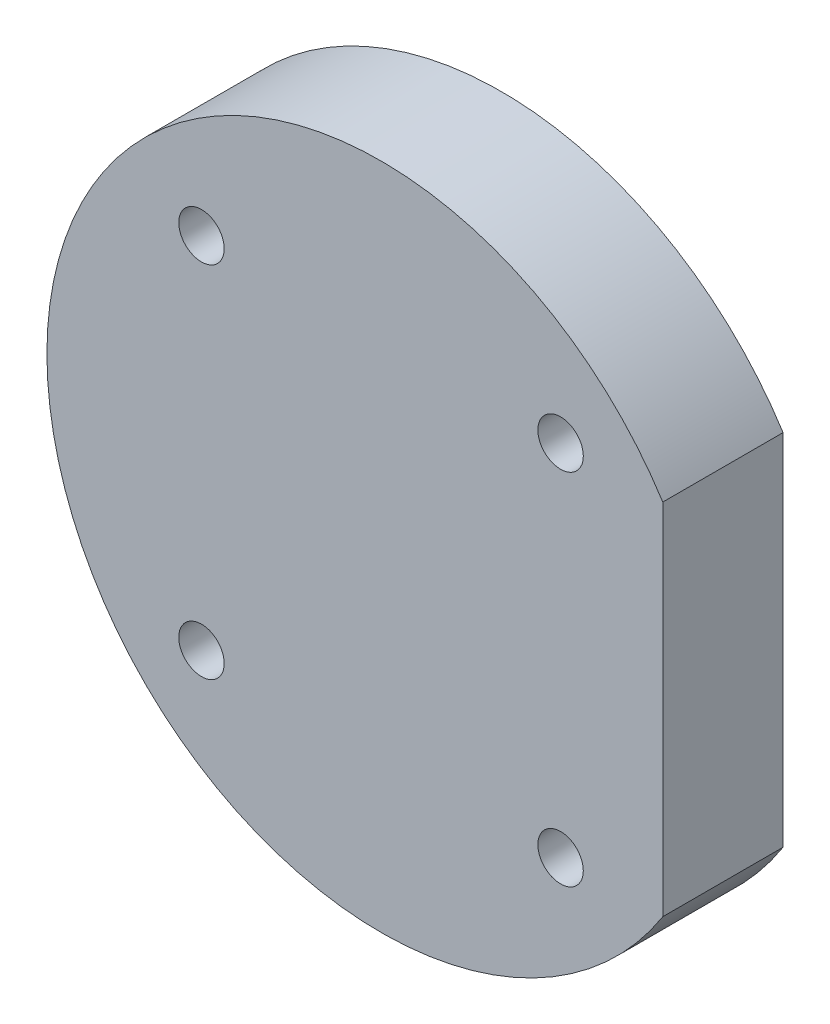
ISO-10303-21;
HEADER;
FILE_DESCRIPTION(('STEP AP214'),'2;1');
FILE_NAME('part.step','',(''),(''),'','','');
FILE_SCHEMA(('AUTOMOTIVE_DESIGN { 1 0 10303 214 1 1 1 1 }'));
ENDSEC;
DATA;
#1=APPLICATION_CONTEXT('core data for automotive mechanical design processes');
#2=APPLICATION_PROTOCOL_DEFINITION('international standard','automotive_design',2000,#1);
#3=PRODUCT_CONTEXT('',#1,'mechanical');
#4=PRODUCT('Part','Part','',(#3));
#5=PRODUCT_RELATED_PRODUCT_CATEGORY('part','',(#4));
#6=PRODUCT_DEFINITION_FORMATION('','',#4);
#7=PRODUCT_DEFINITION_CONTEXT('part definition',#1,'design');
#8=PRODUCT_DEFINITION('design','',#6,#7);
#9=PRODUCT_DEFINITION_SHAPE('','',#8);
#10=(LENGTH_UNIT() NAMED_UNIT(*) SI_UNIT(.MILLI.,.METRE.));
#11=(NAMED_UNIT(*) PLANE_ANGLE_UNIT() SI_UNIT($,.RADIAN.));
#12=(NAMED_UNIT(*) SI_UNIT($,.STERADIAN.) SOLID_ANGLE_UNIT());
#13=UNCERTAINTY_MEASURE_WITH_UNIT(LENGTH_MEASURE(1.E-05),#10,'distance_accuracy_value','');
#14=(GEOMETRIC_REPRESENTATION_CONTEXT(3) GLOBAL_UNCERTAINTY_ASSIGNED_CONTEXT((#13)) GLOBAL_UNIT_ASSIGNED_CONTEXT((#10,
#11,#12)) REPRESENTATION_CONTEXT('',''));
#15=CARTESIAN_POINT('',(0.,0.,0.));
#16=DIRECTION('',(0.,0.,1.));
#17=DIRECTION('',(1.,0.,0.));
#18=AXIS2_PLACEMENT_3D('',#15,#16,#17);
#19=CARTESIAN_POINT('',(0.,0.,9.));
#20=DIRECTION('',(0.,0.,1.));
#21=DIRECTION('',(1.,0.,0.));
#22=AXIS2_PLACEMENT_3D('',#19,#20,#21);
#23=PLANE('',#22);
#24=DIRECTION('',(0.,1.,0.));
#25=VECTOR('',#24,1.);
#26=CARTESIAN_POINT('',(21.083168642308,13.4350288425444,9.));
#27=LINE('',#26,#25);
#28=CARTESIAN_POINT('',(21.083168642308,-13.4350288425444,9.));
#29=VERTEX_POINT('',#28);
#30=CARTESIAN_POINT('',(21.083168642308,13.4350288425444,9.));
#31=VERTEX_POINT('',#30);
#32=EDGE_CURVE('E205',#29,#31,#27,.T.);
#33=ORIENTED_EDGE('',*,*,#32,.T.);
#34=CARTESIAN_POINT('',(0.,0.,9.));
#35=DIRECTION('',(0.,0.,1.));
#36=DIRECTION('',(1.,0.,0.));
#37=AXIS2_PLACEMENT_3D('',#34,#35,#36);
#38=CIRCLE('',#37,25.);
#39=EDGE_CURVE('E124',#31,#29,#38,.T.);
#40=ORIENTED_EDGE('',*,*,#39,.T.);
#41=EDGE_LOOP('',(#33,#40));
#42=FACE_BOUND('',#41,.T.);
#43=CARTESIAN_POINT('',(13.4350288425444,-13.4350288425444,9.));
#44=DIRECTION('',(0.,0.,1.));
#45=DIRECTION('',(1.,0.,0.));
#46=AXIS2_PLACEMENT_3D('',#43,#44,#45);
#47=CIRCLE('',#46,1.7);
#48=CARTESIAN_POINT('',(15.1350288425444,-13.4350288425444,9.));
#49=VERTEX_POINT('',#48);
#50=EDGE_CURVE('E227',#49,#49,#47,.T.);
#51=ORIENTED_EDGE('',*,*,#50,.F.);
#52=EDGE_LOOP('',(#51));
#53=FACE_BOUND('',#52,.T.);
#54=CARTESIAN_POINT('',(13.4350288425444,13.4350288425444,9.));
#55=DIRECTION('',(0.,0.,1.));
#56=DIRECTION('',(1.,0.,0.));
#57=AXIS2_PLACEMENT_3D('',#54,#55,#56);
#58=CIRCLE('',#57,1.7);
#59=CARTESIAN_POINT('',(15.1350288425444,13.4350288425444,9.));
#60=VERTEX_POINT('',#59);
#61=EDGE_CURVE('E243',#60,#60,#58,.T.);
#62=ORIENTED_EDGE('',*,*,#61,.F.);
#63=EDGE_LOOP('',(#62));
#64=FACE_BOUND('',#63,.T.);
#65=CARTESIAN_POINT('',(-13.4350288425444,13.4350288425444,9.));
#66=DIRECTION('',(0.,0.,1.));
#67=DIRECTION('',(1.,0.,0.));
#68=AXIS2_PLACEMENT_3D('',#65,#66,#67);
#69=CIRCLE('',#68,1.7);
#70=CARTESIAN_POINT('',(-11.7350288425444,13.4350288425444,9.));
#71=VERTEX_POINT('',#70);
#72=EDGE_CURVE('E235',#71,#71,#69,.T.);
#73=ORIENTED_EDGE('',*,*,#72,.F.);
#74=EDGE_LOOP('',(#73));
#75=FACE_BOUND('',#74,.T.);
#76=CARTESIAN_POINT('',(-13.4350288425444,-13.4350288425444,9.));
#77=DIRECTION('',(0.,0.,1.));
#78=DIRECTION('',(1.,0.,0.));
#79=AXIS2_PLACEMENT_3D('',#76,#77,#78);
#80=CIRCLE('',#79,1.7);
#81=CARTESIAN_POINT('',(-11.7350288425444,-13.4350288425444,9.));
#82=VERTEX_POINT('',#81);
#83=EDGE_CURVE('E219',#82,#82,#80,.T.);
#84=ORIENTED_EDGE('',*,*,#83,.F.);
#85=EDGE_LOOP('',(#84));
#86=FACE_BOUND('',#85,.T.);
#87=ADVANCED_FACE('F40',(#42,#53,#64,#75,#86),#23,.T.);
#88=CARTESIAN_POINT('',(0.,0.,0.));
#89=DIRECTION('',(0.,0.,1.));
#90=DIRECTION('',(1.,0.,0.));
#91=AXIS2_PLACEMENT_3D('',#88,#89,#90);
#92=PLANE('',#91);
#93=CARTESIAN_POINT('',(0.,0.,0.));
#94=DIRECTION('',(0.,0.,1.));
#95=DIRECTION('',(1.,0.,0.));
#96=AXIS2_PLACEMENT_3D('',#93,#94,#95);
#97=CIRCLE('',#96,25.);
#98=CARTESIAN_POINT('',(-24.8193472919817,-2.99999999999999,0.));
#99=VERTEX_POINT('',#98);
#100=CARTESIAN_POINT('',(21.083168642308,-13.4350288425444,0.));
#101=VERTEX_POINT('',#100);
#102=EDGE_CURVE('E247',#99,#101,#97,.T.);
#103=ORIENTED_EDGE('',*,*,#102,.F.);
#104=DIRECTION('',(-1.,0.,0.));
#105=VECTOR('',#104,1.);
#106=CARTESIAN_POINT('',(-28.1130547912198,-2.99999999999999,0.));
#107=LINE('',#106,#105);
#108=CARTESIAN_POINT('',(-10.5830052442584,-3.,0.));
#109=VERTEX_POINT('',#108);
#110=EDGE_CURVE('E195',#109,#99,#107,.T.);
#111=ORIENTED_EDGE('',*,*,#110,.F.);
#112=CARTESIAN_POINT('',(0.,0.,0.));
#113=DIRECTION('',(0.,0.,-1.));
#114=DIRECTION('',(-1.,0.,0.));
#115=AXIS2_PLACEMENT_3D('',#112,#113,#114);
#116=CIRCLE('',#115,11.);
#117=CARTESIAN_POINT('',(-10.5830052442584,3.00000000000001,0.));
#118=VERTEX_POINT('',#117);
#119=EDGE_CURVE('E214',#118,#109,#116,.T.);
#120=ORIENTED_EDGE('',*,*,#119,.F.);
#121=DIRECTION('',(1.,0.,0.));
#122=VECTOR('',#121,1.);
#123=CARTESIAN_POINT('',(-28.1130547912198,3.00000000000001,0.));
#124=LINE('',#123,#122);
#125=CARTESIAN_POINT('',(-24.8193472919817,3.00000000000001,0.));
#126=VERTEX_POINT('',#125);
#127=EDGE_CURVE('E268',#126,#118,#124,.T.);
#128=ORIENTED_EDGE('',*,*,#127,.F.);
#129=CARTESIAN_POINT('',(21.083168642308,13.4350288425444,0.));
#130=VERTEX_POINT('',#129);
#131=EDGE_CURVE('E131',#130,#126,#97,.T.);
#132=ORIENTED_EDGE('',*,*,#131,.F.);
#133=DIRECTION('',(0.,1.,0.));
#134=VECTOR('',#133,1.);
#135=CARTESIAN_POINT('',(21.083168642308,13.4350288425444,0.));
#136=LINE('',#135,#134);
#137=EDGE_CURVE('E69',#101,#130,#136,.T.);
#138=ORIENTED_EDGE('',*,*,#137,.F.);
#139=EDGE_LOOP('',(#103,#111,#120,#128,#132,#138));
#140=FACE_BOUND('',#139,.T.);
#141=CARTESIAN_POINT('',(13.4350288425444,13.4350288425444,0.));
#142=DIRECTION('',(0.,0.,1.));
#143=DIRECTION('',(1.,0.,0.));
#144=AXIS2_PLACEMENT_3D('',#141,#142,#143);
#145=CIRCLE('',#144,1.7);
#146=CARTESIAN_POINT('',(15.1350288425444,13.4350288425444,0.));
#147=VERTEX_POINT('',#146);
#148=EDGE_CURVE('E239',#147,#147,#145,.T.);
#149=ORIENTED_EDGE('',*,*,#148,.T.);
#150=EDGE_LOOP('',(#149));
#151=FACE_BOUND('',#150,.T.);
#152=CARTESIAN_POINT('',(-13.4350288425444,13.4350288425444,0.));
#153=DIRECTION('',(0.,0.,1.));
#154=DIRECTION('',(1.,0.,0.));
#155=AXIS2_PLACEMENT_3D('',#152,#153,#154);
#156=CIRCLE('',#155,1.7);
#157=CARTESIAN_POINT('',(-11.7350288425444,13.4350288425444,0.));
#158=VERTEX_POINT('',#157);
#159=EDGE_CURVE('E231',#158,#158,#156,.T.);
#160=ORIENTED_EDGE('',*,*,#159,.T.);
#161=EDGE_LOOP('',(#160));
#162=FACE_BOUND('',#161,.T.);
#163=CARTESIAN_POINT('',(13.4350288425444,-13.4350288425444,0.));
#164=DIRECTION('',(0.,0.,1.));
#165=DIRECTION('',(1.,0.,0.));
#166=AXIS2_PLACEMENT_3D('',#163,#164,#165);
#167=CIRCLE('',#166,1.7);
#168=CARTESIAN_POINT('',(15.1350288425444,-13.4350288425444,0.));
#169=VERTEX_POINT('',#168);
#170=EDGE_CURVE('E223',#169,#169,#167,.T.);
#171=ORIENTED_EDGE('',*,*,#170,.T.);
#172=EDGE_LOOP('',(#171));
#173=FACE_BOUND('',#172,.T.);
#174=CARTESIAN_POINT('',(-13.4350288425444,-13.4350288425444,0.));
#175=DIRECTION('',(0.,0.,1.));
#176=DIRECTION('',(1.,0.,0.));
#177=AXIS2_PLACEMENT_3D('',#174,#175,#176);
#178=CIRCLE('',#177,1.7);
#179=CARTESIAN_POINT('',(-11.7350288425444,-13.4350288425444,0.));
#180=VERTEX_POINT('',#179);
#181=EDGE_CURVE('E218',#180,#180,#178,.T.);
#182=ORIENTED_EDGE('',*,*,#181,.T.);
#183=EDGE_LOOP('',(#182));
#184=FACE_BOUND('',#183,.T.);
#185=ADVANCED_FACE('F176',(#140,#151,#162,#173,#184),#92,.F.);
#186=CARTESIAN_POINT('',(0.,0.,9.));
#187=DIRECTION('',(0.,0.,-1.));
#188=DIRECTION('',(-1.,0.,0.));
#189=AXIS2_PLACEMENT_3D('',#186,#187,#188);
#190=CYLINDRICAL_SURFACE('',#189,25.);
#191=CARTESIAN_POINT('',(0.,0.,6.));
#192=DIRECTION('',(0.,0.,-1.));
#193=DIRECTION('',(-1.,0.,0.));
#194=AXIS2_PLACEMENT_3D('',#191,#192,#193);
#195=CIRCLE('',#194,25.);
#196=CARTESIAN_POINT('',(-24.8193472919817,-2.99999999999999,6.));
#197=VERTEX_POINT('',#196);
#198=CARTESIAN_POINT('',(-24.8193472919817,3.00000000000001,6.));
#199=VERTEX_POINT('',#198);
#200=EDGE_CURVE('E113',#197,#199,#195,.T.);
#201=ORIENTED_EDGE('',*,*,#200,.F.);
#202=DIRECTION('',(0.,0.,-1.));
#203=VECTOR('',#202,1.);
#204=CARTESIAN_POINT('',(-24.8193472919817,-2.99999999999999,9.));
#205=LINE('',#204,#203);
#206=EDGE_CURVE('E110',#197,#99,#205,.T.);
#207=ORIENTED_EDGE('',*,*,#206,.T.);
#208=ORIENTED_EDGE('',*,*,#102,.T.);
#209=DIRECTION('',(0.,0.,-1.));
#210=VECTOR('',#209,1.);
#211=CARTESIAN_POINT('',(21.083168642308,-13.4350288425444,9.));
#212=LINE('',#211,#210);
#213=EDGE_CURVE('E128',#101,#29,#212,.F.);
#214=ORIENTED_EDGE('',*,*,#213,.T.);
#215=ORIENTED_EDGE('',*,*,#39,.F.);
#216=DIRECTION('',(0.,0.,-1.));
#217=VECTOR('',#216,1.);
#218=CARTESIAN_POINT('',(21.083168642308,13.4350288425444,9.));
#219=LINE('',#218,#217);
#220=EDGE_CURVE('E209',#31,#130,#219,.T.);
#221=ORIENTED_EDGE('',*,*,#220,.T.);
#222=ORIENTED_EDGE('',*,*,#131,.T.);
#223=DIRECTION('',(0.,0.,-1.));
#224=VECTOR('',#223,1.);
#225=CARTESIAN_POINT('',(-24.8193472919817,3.00000000000001,9.));
#226=LINE('',#225,#224);
#227=EDGE_CURVE('E187',#126,#199,#226,.F.);
#228=ORIENTED_EDGE('',*,*,#227,.T.);
#229=EDGE_LOOP('',(#201,#207,#208,#214,#215,#221,#222,#228));
#230=FACE_BOUND('',#229,.T.);
#231=ADVANCED_FACE('F172',(#230),#190,.T.);
#232=CARTESIAN_POINT('',(13.4350288425444,13.4350288425444,9.));
#233=DIRECTION('',(0.,0.,-1.));
#234=DIRECTION('',(-1.,0.,0.));
#235=AXIS2_PLACEMENT_3D('',#232,#233,#234);
#236=CYLINDRICAL_SURFACE('',#235,1.7);
#237=ORIENTED_EDGE('',*,*,#61,.T.);
#238=EDGE_LOOP('',(#237));
#239=FACE_BOUND('',#238,.T.);
#240=ORIENTED_EDGE('',*,*,#148,.F.);
#241=EDGE_LOOP('',(#240));
#242=FACE_BOUND('',#241,.T.);
#243=ADVANCED_FACE('F168',(#239,#242),#236,.F.);
#244=CARTESIAN_POINT('',(-13.4350288425444,13.4350288425444,9.));
#245=DIRECTION('',(0.,0.,-1.));
#246=DIRECTION('',(-1.,0.,0.));
#247=AXIS2_PLACEMENT_3D('',#244,#245,#246);
#248=CYLINDRICAL_SURFACE('',#247,1.7);
#249=ORIENTED_EDGE('',*,*,#72,.T.);
#250=EDGE_LOOP('',(#249));
#251=FACE_BOUND('',#250,.T.);
#252=ORIENTED_EDGE('',*,*,#159,.F.);
#253=EDGE_LOOP('',(#252));
#254=FACE_BOUND('',#253,.T.);
#255=ADVANCED_FACE('F164',(#251,#254),#248,.F.);
#256=CARTESIAN_POINT('',(13.4350288425444,-13.4350288425444,9.));
#257=DIRECTION('',(0.,0.,-1.));
#258=DIRECTION('',(-1.,0.,0.));
#259=AXIS2_PLACEMENT_3D('',#256,#257,#258);
#260=CYLINDRICAL_SURFACE('',#259,1.7);
#261=ORIENTED_EDGE('',*,*,#50,.T.);
#262=EDGE_LOOP('',(#261));
#263=FACE_BOUND('',#262,.T.);
#264=ORIENTED_EDGE('',*,*,#170,.F.);
#265=EDGE_LOOP('',(#264));
#266=FACE_BOUND('',#265,.T.);
#267=ADVANCED_FACE('F160',(#263,#266),#260,.F.);
#268=CARTESIAN_POINT('',(-13.4350288425444,-13.4350288425444,9.));
#269=DIRECTION('',(0.,0.,-1.));
#270=DIRECTION('',(-1.,0.,0.));
#271=AXIS2_PLACEMENT_3D('',#268,#269,#270);
#272=CYLINDRICAL_SURFACE('',#271,1.7);
#273=ORIENTED_EDGE('',*,*,#83,.T.);
#274=EDGE_LOOP('',(#273));
#275=FACE_BOUND('',#274,.T.);
#276=ORIENTED_EDGE('',*,*,#181,.F.);
#277=EDGE_LOOP('',(#276));
#278=FACE_BOUND('',#277,.T.);
#279=ADVANCED_FACE('F156',(#275,#278),#272,.F.);
#280=CARTESIAN_POINT('',(0.,0.,6.));
#281=DIRECTION('',(0.,0.,-1.));
#282=DIRECTION('',(-1.,0.,0.));
#283=AXIS2_PLACEMENT_3D('',#280,#281,#282);
#284=CYLINDRICAL_SURFACE('',#283,11.);
#285=ORIENTED_EDGE('',*,*,#119,.T.);
#286=DIRECTION('',(0.,0.,-1.));
#287=VECTOR('',#286,1.);
#288=CARTESIAN_POINT('',(-10.5830052442584,-3.,6.));
#289=LINE('',#288,#287);
#290=CARTESIAN_POINT('',(-10.5830052442584,-3.,5.5));
#291=VERTEX_POINT('',#290);
#292=EDGE_CURVE('E200',#109,#291,#289,.F.);
#293=ORIENTED_EDGE('',*,*,#292,.T.);
#294=CARTESIAN_POINT('',(0.,0.,5.5));
#295=DIRECTION('',(0.,0.,-1.));
#296=DIRECTION('',(-1.,0.,0.));
#297=AXIS2_PLACEMENT_3D('',#294,#295,#296);
#298=CIRCLE('',#297,11.);
#299=CARTESIAN_POINT('',(-10.5830052442598,3.00000000000001,5.49999999999981));
#300=VERTEX_POINT('',#299);
#301=EDGE_CURVE('E121',#291,#300,#298,.F.);
#302=ORIENTED_EDGE('',*,*,#301,.T.);
#303=DIRECTION('',(0.,0.,-1.));
#304=VECTOR('',#303,1.);
#305=CARTESIAN_POINT('',(-10.5830052442584,3.00000000000001,6.));
#306=LINE('',#305,#304);
#307=EDGE_CURVE('E189',#300,#118,#306,.T.);
#308=ORIENTED_EDGE('',*,*,#307,.T.);
#309=EDGE_LOOP('',(#285,#293,#302,#308));
#310=FACE_BOUND('',#309,.T.);
#311=ADVANCED_FACE('F153',(#310),#284,.F.);
#312=CARTESIAN_POINT('',(0.,0.,6.));
#313=DIRECTION('',(0.,0.,-1.));
#314=DIRECTION('',(-1.,0.,0.));
#315=AXIS2_PLACEMENT_3D('',#312,#313,#314);
#316=PLANE('',#315);
#317=CARTESIAN_POINT('',(0.,0.,6.));
#318=DIRECTION('',(0.,0.,-1.));
#319=DIRECTION('',(-1.,0.,0.));
#320=AXIS2_PLACEMENT_3D('',#317,#318,#319);
#321=CIRCLE('',#320,10.5);
#322=CARTESIAN_POINT('',(-10.0623058987491,3.00000000000001,6.));
#323=VERTEX_POINT('',#322);
#324=CARTESIAN_POINT('',(-10.0623058987491,-3.,6.));
#325=VERTEX_POINT('',#324);
#326=EDGE_CURVE('E119',#323,#325,#321,.T.);
#327=ORIENTED_EDGE('',*,*,#326,.T.);
#328=DIRECTION('',(-1.,0.,0.));
#329=VECTOR('',#328,1.);
#330=CARTESIAN_POINT('',(-28.1130547912198,-2.99999999999999,6.));
#331=LINE('',#330,#329);
#332=EDGE_CURVE('E106',#325,#197,#331,.T.);
#333=ORIENTED_EDGE('',*,*,#332,.T.);
#334=ORIENTED_EDGE('',*,*,#200,.T.);
#335=DIRECTION('',(1.,0.,0.));
#336=VECTOR('',#335,1.);
#337=CARTESIAN_POINT('',(-28.1130547912198,3.00000000000001,6.));
#338=LINE('',#337,#336);
#339=EDGE_CURVE('E61',#199,#323,#338,.T.);
#340=ORIENTED_EDGE('',*,*,#339,.T.);
#341=EDGE_LOOP('',(#327,#333,#334,#340));
#342=FACE_BOUND('',#341,.T.);
#343=ADVANCED_FACE('F122',(#342),#316,.T.);
#344=CARTESIAN_POINT('',(0.,0.,5.5));
#345=DIRECTION('',(0.,0.,-1.));
#346=DIRECTION('',(-1.,0.,0.));
#347=AXIS2_PLACEMENT_3D('',#344,#345,#346);
#348=TOROIDAL_SURFACE('',#347,10.5,0.5);
#349=ORIENTED_EDGE('',*,*,#301,.F.);
#350=CARTESIAN_POINT('',(-10.5693874990842,-3.,5.61370687911136));
#351=CARTESIAN_POINT('',(-10.5628393005221,-3.,5.64067479665005));
#352=CARTESIAN_POINT('',(-10.553959162086,-3.,5.6671005053182));
#353=CARTESIAN_POINT('',(-10.5318383229587,-3.,5.71808618242449));
#354=CARTESIAN_POINT('',(-10.5185913017283,-3.,5.74264338263267));
#355=CARTESIAN_POINT('',(-10.4882101493525,-3.,5.78915737298589));
#356=CARTESIAN_POINT('',(-10.471083061635,-3.,5.81111876667199));
#357=CARTESIAN_POINT('',(-10.4334731704295,-3.,5.85193248219489));
#358=CARTESIAN_POINT('',(-10.4129910927619,-3.,5.87078547473879));
#359=CARTESIAN_POINT('',(-10.3687311547526,-3.,5.90537684082903));
#360=CARTESIAN_POINT('',(-10.3448847713881,-3.,5.9210274650614));
#361=CARTESIAN_POINT('',(-10.2949793739735,-3.,5.94827635948349));
#362=CARTESIAN_POINT('',(-10.2689198698893,-3.,5.95987372926923));
#363=CARTESIAN_POINT('',(-10.2142569462085,-3.,5.97914630148087));
#364=CARTESIAN_POINT('',(-10.1855942221677,-3.,5.98665339623866));
#365=CARTESIAN_POINT('',(-10.127428093006,-3.,5.9968986399594));
#366=CARTESIAN_POINT('',(-10.0979245406893,-3.,5.99963594864489));
#367=CARTESIAN_POINT('',(-10.0380129834037,-3.,6.00030547139362));
#368=CARTESIAN_POINT('',(-10.0076033278125,-3.,5.99809749067168));
#369=CARTESIAN_POINT('',(-9.94757506734846,-3.,5.98864161555518));
#370=CARTESIAN_POINT('',(-9.91795652898295,-3.,5.98139329880729));
#371=CARTESIAN_POINT('',(-9.86018863583264,-3.,5.96196102209171));
#372=CARTESIAN_POINT('',(-9.83204883013477,-3.,5.94974859506966));
#373=CARTESIAN_POINT('',(-9.77828283301962,-3.,5.92066801420495));
#374=CARTESIAN_POINT('',(-9.75265643678838,-3.,5.90380024014745));
#375=CARTESIAN_POINT('',(-9.70529955702746,-3.,5.86625691106217));
#376=CARTESIAN_POINT('',(-9.68349406687048,-3.,5.84567610731618));
#377=CARTESIAN_POINT('',(-9.64383726499204,-3.,5.8010012964437));
#378=CARTESIAN_POINT('',(-9.62598493108573,-3.,5.77690820018434));
#379=CARTESIAN_POINT('',(-9.59556843379097,-3.,5.72699476046517));
#380=CARTESIAN_POINT('',(-9.58281072729057,-3.,5.70129238924654));
#381=CARTESIAN_POINT('',(-9.56200866735423,-3.,5.64804637078094));
#382=CARTESIAN_POINT('',(-9.55396298314189,-3.,5.62050324585306));
#383=CARTESIAN_POINT('',(-9.54313332493455,-3.,5.56560243960003));
#384=CARTESIAN_POINT('',(-9.54014305600389,-3.,5.5382853220591));
#385=CARTESIAN_POINT('',(-9.53889078221212,-3.,5.48354471304814));
#386=CARTESIAN_POINT('',(-9.5406280935001,-3.,5.45612123753596));
#387=CARTESIAN_POINT('',(-9.54868508670411,-3.,5.40249907391778));
#388=CARTESIAN_POINT('',(-9.55491609340573,-3.,5.37628697732007));
#389=CARTESIAN_POINT('',(-9.57163832626016,-3.,5.32526160733263));
#390=CARTESIAN_POINT('',(-9.58212967323672,-3.,5.30044837363756));
#391=CARTESIAN_POINT('',(-9.60717161147398,-3.,5.25257544417142));
#392=CARTESIAN_POINT('',(-9.62177065876072,-3.,5.22954114218266));
#393=CARTESIAN_POINT('',(-9.65449991769417,-3.,5.18613825095506));
#394=CARTESIAN_POINT('',(-9.67263067861349,-3.,5.16577007719288));
#395=CARTESIAN_POINT('',(-9.71260570401399,-3.,5.12747069385008));
#396=CARTESIAN_POINT('',(-9.73456176372057,-3.,5.10965623871835));
#397=CARTESIAN_POINT('',(-9.78104696881778,-3.,5.07778208621086));
#398=CARTESIAN_POINT('',(-9.80557666040152,-3.,5.06372318811821));
#399=CARTESIAN_POINT('',(-9.85766324366386,-3.,5.03912154798002));
#400=CARTESIAN_POINT('',(-9.8853056664983,-3.,5.02875977679424));
#401=CARTESIAN_POINT('',(-9.941906655498,-3.,5.01266160056117));
#402=CARTESIAN_POINT('',(-9.9708654673127,-3.,5.00692606258253));
#403=CARTESIAN_POINT('',(-10.0302629456984,-3.,5.00009637222065));
#404=CARTESIAN_POINT('',(-10.0607193747651,-3.,4.99915578939087));
#405=CARTESIAN_POINT('',(-10.1213658805215,-3.,5.00236249064431));
#406=CARTESIAN_POINT('',(-10.1515559341406,-3.,5.00651021114565));
#407=CARTESIAN_POINT('',(-10.2110092111955,-3.,5.0198621583929));
#408=CARTESIAN_POINT('',(-10.2402650439428,-3.,5.02909942078544));
#409=CARTESIAN_POINT('',(-10.2967622961234,-3.,5.05245545202905));
#410=CARTESIAN_POINT('',(-10.3240038717341,-3.,5.06657384193415));
#411=CARTESIAN_POINT('',(-10.375074503919,-3.,5.09901637002118));
#412=CARTESIAN_POINT('',(-10.3989622132228,-3.,5.11724805594579));
#413=CARTESIAN_POINT('',(-10.443185699363,-3.,5.157605289078));
#414=CARTESIAN_POINT('',(-10.4635223778483,-3.,5.17972984496681));
#415=CARTESIAN_POINT('',(-10.4992425340995,-3.,5.22635663210449));
#416=CARTESIAN_POINT('',(-10.5147834677409,-3.,5.2507382232365));
#417=CARTESIAN_POINT('',(-10.5413700521138,-3.,5.30184996749589));
#418=CARTESIAN_POINT('',(-10.5524155494274,-3.,5.32858020073867));
#419=CARTESIAN_POINT('',(-10.5692831423429,-3.,5.38255788761337));
#420=CARTESIAN_POINT('',(-10.5752823523868,-3.,5.40975019199442));
#421=CARTESIAN_POINT('',(-10.5825082786879,-3.,5.46473588006266));
#422=CARTESIAN_POINT('',(-10.5837420246128,-3.,5.49252831752601));
#423=CARTESIAN_POINT('',(-10.5819200175944,-3.,5.53595199500101));
#424=CARTESIAN_POINT('',(-10.5804822555139,-3.,5.55166780722536));
#425=CARTESIAN_POINT('',(-10.5760764660983,-3.,5.58288306253033));
#426=CARTESIAN_POINT('',(-10.5731084762681,-3.,5.59838251090435));
#427=CARTESIAN_POINT('',(-10.5693874990842,-3.,5.61370687911136));
#428=B_SPLINE_CURVE_WITH_KNOTS('',3,(#350,#351,#352,#353,#354,#355,#356,#357,#358,#359,#360,
#361,#362,#363,#364,#365,#366,#367,#368,#369,#370,#371,#372,#373,#374,#375,#376,#377,#378,#379,
#380,#381,#382,#383,#384,#385,#386,#387,#388,#389,#390,#391,#392,#393,#394,#395,#396,#397,#398,
#399,#400,#401,#402,#403,#404,#405,#406,#407,#408,#409,#410,#411,#412,#413,#414,#415,#416,#417,
#418,#419,#420,#421,#422,#423,#424,#425,#426,#427),.UNSPECIFIED.,.T.,.F.,(4,2,2,2,2,2,2,2,2,2,2,
2,2,2,2,2,2,2,2,2,2,2,2,2,2,2,2,2,2,2,2,2,2,2,2,2,2,2,4),(0.,0.0831948426814113,
0.166510632533976,0.249676375415534,0.332824149875666,0.418011610674086,0.503217983299868,
0.591703279814202,0.680204162915563,0.771245625531753,0.862294717857547,0.953873474331868,
1.04544476197992,1.13494493475024,1.22442193797658,1.31007141858055,1.39569669825022,
1.47773513053404,1.55976169647785,1.6402124127333,1.72066541073991,1.80211040547319,
1.88356807713305,1.96801284544561,2.05247557157323,2.14063762407171,2.22881619644658,
2.31980190308456,2.41079541401081,2.50238663290543,2.59397074271863,2.68367161463677,
2.77334967721209,2.85965671648478,2.94596670095255,3.02910338354484,3.11211738198172,
3.15939354436679,3.20666854809465),.UNSPECIFIED.);
#429=EDGE_CURVE('E11',#291,#325,#428,.T.);
#430=ORIENTED_EDGE('',*,*,#429,.T.);
#431=ORIENTED_EDGE('',*,*,#326,.F.);
#432=CARTESIAN_POINT('',(-10.5693874990842,3.00000000000001,5.61370687911136));
#433=CARTESIAN_POINT('',(-10.5757784943751,3.00000000000001,5.58737495505135));
#434=CARTESIAN_POINT('',(-10.5799563121818,3.00000000000001,5.56048694431995));
#435=CARTESIAN_POINT('',(-10.5837284647694,3.00000000000001,5.5063716492599));
#436=CARTESIAN_POINT('',(-10.5833180618532,3.00000000000001,5.47914404324614));
#437=CARTESIAN_POINT('',(-10.5779221901405,3.00000000000001,5.42516025012513));
#438=CARTESIAN_POINT('',(-10.5729393118808,3.00000000000001,5.3984038048289));
#439=CARTESIAN_POINT('',(-10.5585735619166,3.00000000000001,5.34610793072379));
#440=CARTESIAN_POINT('',(-10.5491914850408,3.00000000000001,5.32056828298692));
#441=CARTESIAN_POINT('',(-10.5262823612644,3.00000000000001,5.2712694119029));
#442=CARTESIAN_POINT('',(-10.5127349274711,3.00000000000001,5.24751967722429));
#443=CARTESIAN_POINT('',(-10.4819434867069,3.00000000000001,5.20255356627675));
#444=CARTESIAN_POINT('',(-10.4646990025953,3.00000000000001,5.18133751755569));
#445=CARTESIAN_POINT('',(-10.4265256324338,3.00000000000001,5.14141983804273));
#446=CARTESIAN_POINT('',(-10.405510335657,3.00000000000001,5.12280090389833));
#447=CARTESIAN_POINT('',(-10.3607502495251,3.00000000000001,5.08920203559541));
#448=CARTESIAN_POINT('',(-10.3370049801677,3.00000000000001,5.07422274282927));
#449=CARTESIAN_POINT('',(-10.2865025753806,3.00000000000001,5.04772846222436));
#450=CARTESIAN_POINT('',(-10.2596655272931,3.00000000000001,5.03636579907884));
#451=CARTESIAN_POINT('',(-10.2045061666535,3.00000000000001,5.01813553557398));
#452=CARTESIAN_POINT('',(-10.1761835772996,3.00000000000001,5.0112687761754));
#453=CARTESIAN_POINT('',(-10.1178030844788,3.00000000000001,5.00200077128585));
#454=CARTESIAN_POINT('',(-10.0877190981904,3.00000000000001,4.99976337362469));
#455=CARTESIAN_POINT('',(-10.0275917293907,3.00000000000001,5.00027634871137));
#456=CARTESIAN_POINT('',(-9.99754835301946,3.00000000000001,5.00302740612454));
#457=CARTESIAN_POINT('',(-9.93781239875251,3.00000000000001,5.01354313442072));
#458=CARTESIAN_POINT('',(-9.90813486819599,3.00000000000001,5.02139367089929));
#459=CARTESIAN_POINT('',(-9.85053693479313,3.00000000000001,5.04201404961074));
#460=CARTESIAN_POINT('',(-9.82261653272084,3.00000000000001,5.05478389401068));
#461=CARTESIAN_POINT('',(-9.76965869859889,3.00000000000001,5.08479368307891));
#462=CARTESIAN_POINT('',(-9.74459500655154,3.00000000000001,5.10198719714233));
#463=CARTESIAN_POINT('',(-9.69784653445711,3.00000000000001,5.14048281236258));
#464=CARTESIAN_POINT('',(-9.67616111281279,3.00000000000001,5.1617841316458));
#465=CARTESIAN_POINT('',(-9.63764285542351,3.00000000000001,5.20709148479587));
#466=CARTESIAN_POINT('',(-9.62066399667333,3.00000000000001,5.23097326958135));
#467=CARTESIAN_POINT('',(-9.59118138053016,3.00000000000001,5.28135660519703));
#468=CARTESIAN_POINT('',(-9.57867629600426,3.00000000000001,5.30785737613004));
#469=CARTESIAN_POINT('',(-9.5590837393732,3.00000000000001,5.36143074456736));
#470=CARTESIAN_POINT('',(-9.55177649451992,3.00000000000001,5.38842304493706));
#471=CARTESIAN_POINT('',(-9.54196198815884,3.00000000000001,5.44326544786756));
#472=CARTESIAN_POINT('',(-9.53945368036441,3.00000000000001,5.47111536210163));
#473=CARTESIAN_POINT('',(-9.53933447790645,3.00000000000001,5.52594801554161));
#474=CARTESIAN_POINT('',(-9.54157243996489,3.00000000000001,5.55293055532186));
#475=CARTESIAN_POINT('',(-9.55055736475628,3.00000000000001,5.60613178919512));
#476=CARTESIAN_POINT('',(-9.55730412070472,3.00000000000001,5.63235051826084));
#477=CARTESIAN_POINT('',(-9.57505003775295,3.00000000000001,5.68325372435048));
#478=CARTESIAN_POINT('',(-9.58604210570919,3.00000000000001,5.70794068125169));
#479=CARTESIAN_POINT('',(-9.61190741110693,3.00000000000001,5.75518694913021));
#480=CARTESIAN_POINT('',(-9.62678106571849,3.00000000000001,5.77774603106105));
#481=CARTESIAN_POINT('',(-9.66040060418095,3.00000000000001,5.82077882706194));
#482=CARTESIAN_POINT('',(-9.67924197578351,3.00000000000001,5.84117786107374));
#483=CARTESIAN_POINT('',(-9.71995518259979,3.00000000000001,5.87868353361812));
#484=CARTESIAN_POINT('',(-9.74182760948828,3.00000000000001,5.89578952777402));
#485=CARTESIAN_POINT('',(-9.7889859691656,3.00000000000001,5.92700421087225));
#486=CARTESIAN_POINT('',(-9.81437833765948,3.00000000000001,5.94095210334787));
#487=CARTESIAN_POINT('',(-9.86707880097011,3.00000000000001,5.96457327124026));
#488=CARTESIAN_POINT('',(-9.8943873000861,3.00000000000001,5.97424564136968));
#489=CARTESIAN_POINT('',(-9.9512951171465,3.00000000000001,5.98941019988069));
#490=CARTESIAN_POINT('',(-9.9809422860802,3.00000000000001,5.99472318489074));
#491=CARTESIAN_POINT('',(-10.040708537138,3.00000000000001,6.00039917306898));
#492=CARTESIAN_POINT('',(-10.0708276847983,3.00000000000001,6.00076148260801));
#493=CARTESIAN_POINT('',(-10.1312807413405,3.00000000000001,5.99647624948084));
#494=CARTESIAN_POINT('',(-10.1616080389078,3.00000000000001,5.99173437430507));
#495=CARTESIAN_POINT('',(-10.2210230998089,3.00000000000001,5.97718118914315));
#496=CARTESIAN_POINT('',(-10.2501109138052,3.00000000000001,5.96737008657118));
#497=CARTESIAN_POINT('',(-10.3059117604199,3.00000000000001,5.94300586003691));
#498=CARTESIAN_POINT('',(-10.3326442510222,3.00000000000001,5.92849738585167));
#499=CARTESIAN_POINT('',(-10.3831940571688,3.00000000000001,5.89505330601838));
#500=CARTESIAN_POINT('',(-10.4070110943126,3.00000000000001,5.87611727807889));
#501=CARTESIAN_POINT('',(-10.4502238423142,3.00000000000001,5.83498113632885));
#502=CARTESIAN_POINT('',(-10.4697347995957,3.00000000000001,5.81290203195306));
#503=CARTESIAN_POINT('',(-10.5045670722204,3.00000000000001,5.76568388704105));
#504=CARTESIAN_POINT('',(-10.5198947569834,3.00000000000001,5.74054958363363));
#505=CARTESIAN_POINT('',(-10.5407622774997,3.00000000000001,5.69824308275122));
#506=CARTESIAN_POINT('',(-10.5477882366458,3.00000000000001,5.68178750001827));
#507=CARTESIAN_POINT('',(-10.5599929404706,3.00000000000001,5.6482042172279));
#508=CARTESIAN_POINT('',(-10.5651717276264,3.00000000000001,5.63107653263604));
#509=CARTESIAN_POINT('',(-10.5693874990842,3.00000000000001,5.61370687911136));
#510=B_SPLINE_CURVE_WITH_KNOTS('',3,(#432,#433,#434,#435,#436,#437,#438,#439,#440,#441,#442,
#443,#444,#445,#446,#447,#448,#449,#450,#451,#452,#453,#454,#455,#456,#457,#458,#459,#460,#461,
#462,#463,#464,#465,#466,#467,#468,#469,#470,#471,#472,#473,#474,#475,#476,#477,#478,#479,#480,
#481,#482,#483,#484,#485,#486,#487,#488,#489,#490,#491,#492,#493,#494,#495,#496,#497,#498,#499,
#500,#501,#502,#503,#504,#505,#506,#507,#508,#509),.UNSPECIFIED.,.T.,.F.,(4,2,2,2,2,2,2,2,2,2,2,
2,2,2,2,2,2,2,2,2,2,2,2,2,2,2,2,2,2,2,2,2,2,2,2,2,2,2,4),(0.,0.081224063597333,
0.162532005137655,0.243793910068281,0.32504113859276,0.406692529547347,0.488354464766035,
0.572206550544238,0.656073402377974,0.743109891265931,0.830162655719416,0.920247181226424,
1.01034407176804,1.10199878574247,1.19365354009246,1.28438297029084,1.37509514819776,
1.46255726397794,1.54999341280454,1.63346836809989,1.71692512172118,1.79776419270962,
1.87859955647122,1.95930043930206,2.0400099989628,2.12294567135123,2.20589755599751,
2.29242163069755,2.37896401700239,2.46890722742436,2.55886303947888,2.65051036521443,
2.74215394137455,2.83295080812057,2.92375633842939,3.01171369589366,3.09953637337651,
3.1531164416394,3.20669527770688),.UNSPECIFIED.);
#511=EDGE_CURVE('E54',#323,#300,#510,.T.);
#512=ORIENTED_EDGE('',*,*,#511,.T.);
#513=EDGE_LOOP('',(#349,#430,#431,#512));
#514=FACE_BOUND('',#513,.T.);
#515=ADVANCED_FACE('F42',(#514),#348,.F.);
#516=CARTESIAN_POINT('',(21.083168642308,13.4350288425444,9.));
#517=DIRECTION('',(-1.,0.,0.));
#518=DIRECTION('',(0.,0.,1.));
#519=AXIS2_PLACEMENT_3D('',#516,#517,#518);
#520=PLANE('',#519);
#521=ORIENTED_EDGE('',*,*,#137,.T.);
#522=ORIENTED_EDGE('',*,*,#220,.F.);
#523=ORIENTED_EDGE('',*,*,#32,.F.);
#524=ORIENTED_EDGE('',*,*,#213,.F.);
#525=EDGE_LOOP('',(#521,#522,#523,#524));
#526=FACE_BOUND('',#525,.T.);
#527=ADVANCED_FACE('F148',(#526),#520,.F.);
#528=CARTESIAN_POINT('',(-28.1130547912198,-2.99999999999999,6.));
#529=DIRECTION('',(0.,-1.,0.));
#530=DIRECTION('',(1.,0.,0.));
#531=AXIS2_PLACEMENT_3D('',#528,#529,#530);
#532=PLANE('',#531);
#533=ORIENTED_EDGE('',*,*,#332,.F.);
#534=ORIENTED_EDGE('',*,*,#429,.F.);
#535=ORIENTED_EDGE('',*,*,#292,.F.);
#536=ORIENTED_EDGE('',*,*,#110,.T.);
#537=ORIENTED_EDGE('',*,*,#206,.F.);
#538=EDGE_LOOP('',(#533,#534,#535,#536,#537));
#539=FACE_BOUND('',#538,.T.);
#540=ADVANCED_FACE('F107',(#539),#532,.F.);
#541=CARTESIAN_POINT('',(-28.1130547912198,3.00000000000001,6.));
#542=DIRECTION('',(0.,1.,0.));
#543=DIRECTION('',(-1.,0.,0.));
#544=AXIS2_PLACEMENT_3D('',#541,#542,#543);
#545=PLANE('',#544);
#546=ORIENTED_EDGE('',*,*,#127,.T.);
#547=ORIENTED_EDGE('',*,*,#307,.F.);
#548=ORIENTED_EDGE('',*,*,#511,.F.);
#549=ORIENTED_EDGE('',*,*,#339,.F.);
#550=ORIENTED_EDGE('',*,*,#227,.F.);
#551=EDGE_LOOP('',(#546,#547,#548,#549,#550));
#552=FACE_BOUND('',#551,.T.);
#553=ADVANCED_FACE('F142',(#552),#545,.F.);
#554=CLOSED_SHELL('',(#87,#185,#231,#243,#255,#267,#279,#311,#343,#515,#527,#540,#553));
#555=MANIFOLD_SOLID_BREP('B2',#554);
#556=ADVANCED_BREP_SHAPE_REPRESENTATION('',(#18,#555),#14);
#557=SHAPE_DEFINITION_REPRESENTATION(#9,#556);
ENDSEC;
END-ISO-10303-21;
